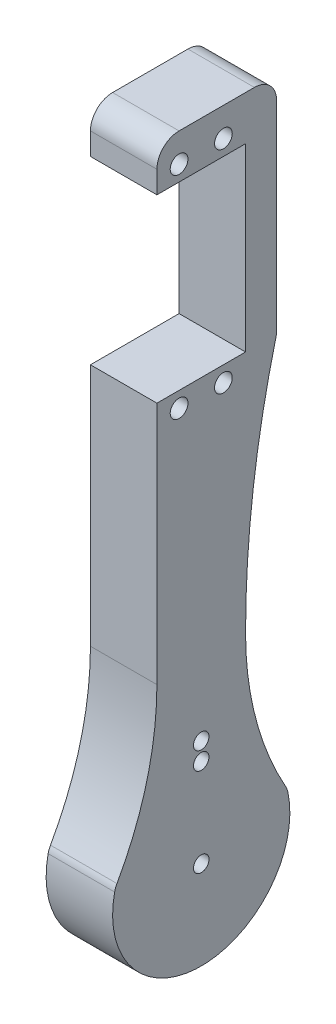
ISO-10303-21;
HEADER;
FILE_DESCRIPTION(('STEP AP214'),'2;1');
FILE_NAME('part.step','',(''),(''),'','','');
FILE_SCHEMA(('AUTOMOTIVE_DESIGN { 1 0 10303 214 1 1 1 1 }'));
ENDSEC;
DATA;
#1=APPLICATION_CONTEXT('core data for automotive mechanical design processes');
#2=APPLICATION_PROTOCOL_DEFINITION('international standard','automotive_design',2000,#1);
#3=PRODUCT_CONTEXT('',#1,'mechanical');
#4=PRODUCT('Part','Part','',(#3));
#5=PRODUCT_RELATED_PRODUCT_CATEGORY('part','',(#4));
#6=PRODUCT_DEFINITION_FORMATION('','',#4);
#7=PRODUCT_DEFINITION_CONTEXT('part definition',#1,'design');
#8=PRODUCT_DEFINITION('design','',#6,#7);
#9=PRODUCT_DEFINITION_SHAPE('','',#8);
#10=(LENGTH_UNIT() NAMED_UNIT(*) SI_UNIT(.MILLI.,.METRE.));
#11=(NAMED_UNIT(*) PLANE_ANGLE_UNIT() SI_UNIT($,.RADIAN.));
#12=(NAMED_UNIT(*) SI_UNIT($,.STERADIAN.) SOLID_ANGLE_UNIT());
#13=UNCERTAINTY_MEASURE_WITH_UNIT(LENGTH_MEASURE(1.E-05),#10,'distance_accuracy_value','');
#14=(GEOMETRIC_REPRESENTATION_CONTEXT(3) GLOBAL_UNCERTAINTY_ASSIGNED_CONTEXT((#13)) GLOBAL_UNIT_ASSIGNED_CONTEXT((#10,
#11,#12)) REPRESENTATION_CONTEXT('',''));
#15=CARTESIAN_POINT('',(0.,0.,0.));
#16=DIRECTION('',(0.,0.,1.));
#17=DIRECTION('',(1.,0.,0.));
#18=AXIS2_PLACEMENT_3D('',#15,#16,#17);
#19=CARTESIAN_POINT('',(15.,40.,80.));
#20=DIRECTION('',(-1.,0.,0.));
#21=DIRECTION('',(0.,0.,1.));
#22=AXIS2_PLACEMENT_3D('',#19,#20,#21);
#23=PLANE('',#22);
#24=CARTESIAN_POINT('',(15.,0.,0.));
#25=DIRECTION('',(-1.,0.,0.));
#26=DIRECTION('',(0.,0.,1.));
#27=AXIS2_PLACEMENT_3D('',#24,#25,#26);
#28=CIRCLE('',#27,1.75);
#29=CARTESIAN_POINT('',(15.,0.,1.75));
#30=VERTEX_POINT('',#29);
#31=EDGE_CURVE('E385',#30,#30,#28,.T.);
#32=ORIENTED_EDGE('',*,*,#31,.T.);
#33=EDGE_LOOP('',(#32));
#34=FACE_BOUND('',#33,.T.);
#35=CARTESIAN_POINT('',(15.,20.,0.));
#36=DIRECTION('',(-1.,0.,0.));
#37=DIRECTION('',(0.,0.,1.));
#38=AXIS2_PLACEMENT_3D('',#35,#36,#37);
#39=CIRCLE('',#38,1.75);
#40=CARTESIAN_POINT('',(15.,20.,1.75));
#41=VERTEX_POINT('',#40);
#42=EDGE_CURVE('E552',#41,#41,#39,.T.);
#43=ORIENTED_EDGE('',*,*,#42,.T.);
#44=EDGE_LOOP('',(#43));
#45=FACE_BOUND('',#44,.T.);
#46=CARTESIAN_POINT('',(15.,24.,0.));
#47=DIRECTION('',(-1.,0.,0.));
#48=DIRECTION('',(0.,0.,1.));
#49=AXIS2_PLACEMENT_3D('',#46,#47,#48);
#50=CIRCLE('',#49,1.75);
#51=CARTESIAN_POINT('',(15.,24.,1.75));
#52=VERTEX_POINT('',#51);
#53=EDGE_CURVE('E545',#52,#52,#50,.T.);
#54=ORIENTED_EDGE('',*,*,#53,.T.);
#55=EDGE_LOOP('',(#54));
#56=FACE_BOUND('',#55,.T.);
#57=DIRECTION('',(0.,0.,1.));
#58=VECTOR('',#57,1.);
#59=CARTESIAN_POINT('',(15.,95.,-10.));
#60=LINE('',#59,#58);
#61=CARTESIAN_POINT('',(15.,95.,-10.));
#62=VERTEX_POINT('',#61);
#63=CARTESIAN_POINT('',(15.,95.,10.));
#64=VERTEX_POINT('',#63);
#65=EDGE_CURVE('E261',#62,#64,#60,.T.);
#66=ORIENTED_EDGE('',*,*,#65,.T.);
#67=DIRECTION('',(0.,-1.,0.));
#68=VECTOR('',#67,1.);
#69=CARTESIAN_POINT('',(15.,95.,10.));
#70=LINE('',#69,#68);
#71=CARTESIAN_POINT('',(15.,40.,10.));
#72=VERTEX_POINT('',#71);
#73=EDGE_CURVE('E139',#64,#72,#70,.T.);
#74=ORIENTED_EDGE('',*,*,#73,.T.);
#75=CARTESIAN_POINT('',(15.,40.,80.));
#76=DIRECTION('',(-1.,0.,0.));
#77=DIRECTION('',(0.,0.,1.));
#78=AXIS2_PLACEMENT_3D('',#75,#76,#77);
#79=CIRCLE('',#78,70.);
#80=CARTESIAN_POINT('',(15.,5.63781686233499,19.0144249021658));
#81=VERTEX_POINT('',#80);
#82=EDGE_CURVE('E316',#72,#81,#79,.T.);
#83=ORIENTED_EDGE('',*,*,#82,.T.);
#84=CARTESIAN_POINT('',(15.,3.18337520964461,14.6583123951777));
#85=DIRECTION('',(1.,0.,0.));
#86=DIRECTION('',(0.,0.,-1.));
#87=AXIS2_PLACEMENT_3D('',#84,#85,#86);
#88=CIRCLE('',#87,5.);
#89=CARTESIAN_POINT('',(15.,4.24450027952615,19.5444165269036));
#90=VERTEX_POINT('',#89);
#91=EDGE_CURVE('E336',#81,#90,#88,.T.);
#92=ORIENTED_EDGE('',*,*,#91,.T.);
#93=CARTESIAN_POINT('',(15.,0.,0.));
#94=DIRECTION('',(1.,0.,0.));
#95=DIRECTION('',(0.,0.,-1.));
#96=AXIS2_PLACEMENT_3D('',#93,#94,#95);
#97=CIRCLE('',#96,20.);
#98=CARTESIAN_POINT('',(15.,4.24450027952615,-19.5444165269036));
#99=VERTEX_POINT('',#98);
#100=EDGE_CURVE('E332',#90,#99,#97,.T.);
#101=ORIENTED_EDGE('',*,*,#100,.T.);
#102=CARTESIAN_POINT('',(15.,3.18337520964461,-14.6583123951777));
#103=DIRECTION('',(1.,0.,0.));
#104=DIRECTION('',(0.,0.,1.));
#105=AXIS2_PLACEMENT_3D('',#102,#103,#104);
#106=CIRCLE('',#105,5.);
#107=CARTESIAN_POINT('',(15.,5.63781686233497,-19.0144249021658));
#108=VERTEX_POINT('',#107);
#109=EDGE_CURVE('E335',#99,#108,#106,.T.);
#110=ORIENTED_EDGE('',*,*,#109,.T.);
#111=CARTESIAN_POINT('',(15.,40.,-80.));
#112=DIRECTION('',(-1.,0.,0.));
#113=DIRECTION('',(0.,0.,-1.));
#114=AXIS2_PLACEMENT_3D('',#111,#112,#113);
#115=CIRCLE('',#114,70.);
#116=CARTESIAN_POINT('',(15.,40.,-10.));
#117=VERTEX_POINT('',#116);
#118=EDGE_CURVE('E342',#108,#117,#115,.T.);
#119=ORIENTED_EDGE('',*,*,#118,.T.);
#120=CARTESIAN_POINT('',(15.,40.,-229.571428571429));
#121=DIRECTION('',(-1.,0.,0.));
#122=DIRECTION('',(0.,0.,1.));
#123=AXIS2_PLACEMENT_3D('',#120,#121,#122);
#124=CIRCLE('',#123,219.571428571429);
#125=CARTESIAN_POINT('',(15.,94.394082104943,-16.8441475826972));
#126=VERTEX_POINT('',#125);
#127=EDGE_CURVE('E349',#117,#126,#124,.T.);
#128=ORIENTED_EDGE('',*,*,#127,.T.);
#129=CARTESIAN_POINT('',(15.,95.6327241828045,-12.));
#130=DIRECTION('',(1.,0.,0.));
#131=DIRECTION('',(0.,0.,1.));
#132=AXIS2_PLACEMENT_3D('',#129,#130,#131);
#133=CIRCLE('',#132,4.99999999999999);
#134=CARTESIAN_POINT('',(15.,95.6327241828045,-17.));
#135=VERTEX_POINT('',#134);
#136=EDGE_CURVE('E351',#126,#135,#133,.T.);
#137=ORIENTED_EDGE('',*,*,#136,.T.);
#138=DIRECTION('',(0.,1.,0.));
#139=VECTOR('',#138,1.);
#140=CARTESIAN_POINT('',(15.,95.6327241828045,-17.));
#141=LINE('',#140,#139);
#142=CARTESIAN_POINT('',(15.,140.7,-17.));
#143=VERTEX_POINT('',#142);
#144=EDGE_CURVE('E354',#135,#143,#141,.T.);
#145=ORIENTED_EDGE('',*,*,#144,.T.);
#146=CARTESIAN_POINT('',(15.,140.7,-12.));
#147=DIRECTION('',(1.,0.,0.));
#148=DIRECTION('',(0.,0.,1.));
#149=AXIS2_PLACEMENT_3D('',#146,#147,#148);
#150=CIRCLE('',#149,5.);
#151=CARTESIAN_POINT('',(15.,145.7,-12.));
#152=VERTEX_POINT('',#151);
#153=EDGE_CURVE('E357',#143,#152,#150,.T.);
#154=ORIENTED_EDGE('',*,*,#153,.T.);
#155=DIRECTION('',(0.,0.,1.));
#156=VECTOR('',#155,1.);
#157=CARTESIAN_POINT('',(15.,145.7,-12.));
#158=LINE('',#157,#156);
#159=CARTESIAN_POINT('',(15.,145.7,4.99999999999996));
#160=VERTEX_POINT('',#159);
#161=EDGE_CURVE('E360',#152,#160,#158,.T.);
#162=ORIENTED_EDGE('',*,*,#161,.T.);
#163=CARTESIAN_POINT('',(15.,140.7,5.));
#164=DIRECTION('',(1.,0.,0.));
#165=DIRECTION('',(0.,0.,-1.));
#166=AXIS2_PLACEMENT_3D('',#163,#164,#165);
#167=CIRCLE('',#166,5.);
#168=CARTESIAN_POINT('',(15.,140.7,10.));
#169=VERTEX_POINT('',#168);
#170=EDGE_CURVE('E186',#160,#169,#167,.T.);
#171=ORIENTED_EDGE('',*,*,#170,.T.);
#172=DIRECTION('',(0.,-1.,0.));
#173=VECTOR('',#172,1.);
#174=CARTESIAN_POINT('',(15.,140.7,10.));
#175=LINE('',#174,#173);
#176=CARTESIAN_POINT('',(15.,135.7,10.));
#177=VERTEX_POINT('',#176);
#178=EDGE_CURVE('E179',#169,#177,#175,.T.);
#179=ORIENTED_EDGE('',*,*,#178,.T.);
#180=DIRECTION('',(0.,0.,-1.));
#181=VECTOR('',#180,1.);
#182=CARTESIAN_POINT('',(15.,135.7,10.));
#183=LINE('',#182,#181);
#184=CARTESIAN_POINT('',(15.,135.7,-10.));
#185=VERTEX_POINT('',#184);
#186=EDGE_CURVE('E183',#177,#185,#183,.T.);
#187=ORIENTED_EDGE('',*,*,#186,.T.);
#188=DIRECTION('',(0.,-1.,0.));
#189=VECTOR('',#188,1.);
#190=CARTESIAN_POINT('',(15.,135.7,-10.));
#191=LINE('',#190,#189);
#192=EDGE_CURVE('E74',#185,#62,#191,.T.);
#193=ORIENTED_EDGE('',*,*,#192,.T.);
#194=EDGE_LOOP('',(#66,#74,#83,#92,#101,#110,#119,#128,#137,#145,#154,#162,#171,#179,#187,#193));
#195=FACE_BOUND('',#194,.T.);
#196=CARTESIAN_POINT('',(15.,139.2,-5.));
#197=DIRECTION('',(1.,0.,0.));
#198=DIRECTION('',(0.,0.,-1.));
#199=AXIS2_PLACEMENT_3D('',#196,#197,#198);
#200=CIRCLE('',#199,2.);
#201=CARTESIAN_POINT('',(15.,139.2,-7.));
#202=VERTEX_POINT('',#201);
#203=EDGE_CURVE('E219',#202,#202,#200,.T.);
#204=ORIENTED_EDGE('',*,*,#203,.F.);
#205=EDGE_LOOP('',(#204));
#206=FACE_BOUND('',#205,.T.);
#207=CARTESIAN_POINT('',(15.,139.2,5.));
#208=DIRECTION('',(1.,0.,0.));
#209=DIRECTION('',(0.,0.,-1.));
#210=AXIS2_PLACEMENT_3D('',#207,#208,#209);
#211=CIRCLE('',#210,2.);
#212=CARTESIAN_POINT('',(15.,139.2,3.));
#213=VERTEX_POINT('',#212);
#214=EDGE_CURVE('E439',#213,#213,#211,.T.);
#215=ORIENTED_EDGE('',*,*,#214,.F.);
#216=EDGE_LOOP('',(#215));
#217=FACE_BOUND('',#216,.T.);
#218=CARTESIAN_POINT('',(15.,91.5,-5.));
#219=DIRECTION('',(1.,0.,0.));
#220=DIRECTION('',(0.,0.,1.));
#221=AXIS2_PLACEMENT_3D('',#218,#219,#220);
#222=CIRCLE('',#221,2.);
#223=CARTESIAN_POINT('',(15.,91.5,-3.00000000000001));
#224=VERTEX_POINT('',#223);
#225=EDGE_CURVE('E447',#224,#224,#222,.T.);
#226=ORIENTED_EDGE('',*,*,#225,.F.);
#227=EDGE_LOOP('',(#226));
#228=FACE_BOUND('',#227,.T.);
#229=CARTESIAN_POINT('',(15.,91.5,4.99999999999999));
#230=DIRECTION('',(1.,0.,0.));
#231=DIRECTION('',(0.,0.,1.));
#232=AXIS2_PLACEMENT_3D('',#229,#230,#231);
#233=CIRCLE('',#232,2.);
#234=CARTESIAN_POINT('',(15.,91.5,6.99999999999999));
#235=VERTEX_POINT('',#234);
#236=EDGE_CURVE('E457',#235,#235,#233,.T.);
#237=ORIENTED_EDGE('',*,*,#236,.F.);
#238=EDGE_LOOP('',(#237));
#239=FACE_BOUND('',#238,.T.);
#240=ADVANCED_FACE('F49',(#34,#45,#56,#195,#206,#217,#228,#239),#23,.F.);
#241=CARTESIAN_POINT('',(0.,40.,80.));
#242=DIRECTION('',(-1.,0.,0.));
#243=DIRECTION('',(0.,0.,1.));
#244=AXIS2_PLACEMENT_3D('',#241,#242,#243);
#245=PLANE('',#244);
#246=CARTESIAN_POINT('',(0.,11.9999999999999,-16.5000000000001));
#247=DIRECTION('',(1.,0.,0.));
#248=DIRECTION('',(0.,0.,-1.));
#249=AXIS2_PLACEMENT_3D('',#246,#247,#248);
#250=CIRCLE('',#249,13.);
#251=CARTESIAN_POINT('',(0.,12.,-3.5000000000001));
#252=VERTEX_POINT('',#251);
#253=CARTESIAN_POINT('',(0.,5.15357012521899,-5.44891869681045));
#254=VERTEX_POINT('',#253);
#255=EDGE_CURVE('E65',#252,#254,#250,.T.);
#256=ORIENTED_EDGE('',*,*,#255,.F.);
#257=DIRECTION('',(0.,-1.,0.));
#258=VECTOR('',#257,1.);
#259=CARTESIAN_POINT('',(0.,24.3305385599999,-3.50000000000017));
#260=LINE('',#259,#258);
#261=CARTESIAN_POINT('',(0.,24.3305385599999,-3.50000000000017));
#262=VERTEX_POINT('',#261);
#263=EDGE_CURVE('E517',#262,#252,#260,.T.);
#264=ORIENTED_EDGE('',*,*,#263,.F.);
#265=CARTESIAN_POINT('',(0.,24.33053856,-1.87350135405495E-13));
#266=DIRECTION('',(-1.,0.,0.));
#267=DIRECTION('',(0.,0.,1.));
#268=AXIS2_PLACEMENT_3D('',#265,#266,#267);
#269=CIRCLE('',#268,3.49999999999998);
#270=CARTESIAN_POINT('',(0.,24.33053856,3.49999999999979));
#271=VERTEX_POINT('',#270);
#272=EDGE_CURVE('E505',#271,#262,#269,.T.);
#273=ORIENTED_EDGE('',*,*,#272,.F.);
#274=DIRECTION('',(0.,1.,0.));
#275=VECTOR('',#274,1.);
#276=CARTESIAN_POINT('',(0.,24.33053856,3.49999999999979));
#277=LINE('',#276,#275);
#278=CARTESIAN_POINT('',(0.,12.,3.4999999999999));
#279=VERTEX_POINT('',#278);
#280=EDGE_CURVE('E525',#279,#271,#277,.T.);
#281=ORIENTED_EDGE('',*,*,#280,.F.);
#282=CARTESIAN_POINT('',(0.,12.0000000000001,16.4999999999999));
#283=DIRECTION('',(1.,0.,0.));
#284=DIRECTION('',(0.,0.,1.));
#285=AXIS2_PLACEMENT_3D('',#282,#283,#284);
#286=CIRCLE('',#285,13.);
#287=CARTESIAN_POINT('',(0.,5.15357012521907,5.44891869681037));
#288=VERTEX_POINT('',#287);
#289=EDGE_CURVE('E529',#288,#279,#286,.T.);
#290=ORIENTED_EDGE('',*,*,#289,.F.);
#291=CARTESIAN_POINT('',(0.,0.,0.));
#292=DIRECTION('',(-1.,0.,0.));
#293=DIRECTION('',(0.,0.,1.));
#294=AXIS2_PLACEMENT_3D('',#291,#292,#293);
#295=CIRCLE('',#294,7.50000000000001);
#296=EDGE_CURVE('E367',#254,#288,#295,.T.);
#297=ORIENTED_EDGE('',*,*,#296,.F.);
#298=EDGE_LOOP('',(#256,#264,#273,#281,#290,#297));
#299=FACE_BOUND('',#298,.T.);
#300=CARTESIAN_POINT('',(0.,91.5,-5.));
#301=DIRECTION('',(1.,0.,0.));
#302=DIRECTION('',(0.,0.,1.));
#303=AXIS2_PLACEMENT_3D('',#300,#301,#302);
#304=CIRCLE('',#303,2.);
#305=CARTESIAN_POINT('',(0.,91.5,-3.00000000000001));
#306=VERTEX_POINT('',#305);
#307=EDGE_CURVE('E453',#306,#306,#304,.T.);
#308=ORIENTED_EDGE('',*,*,#307,.T.);
#309=EDGE_LOOP('',(#308));
#310=FACE_BOUND('',#309,.T.);
#311=CARTESIAN_POINT('',(0.,139.2,-5.));
#312=DIRECTION('',(1.,0.,0.));
#313=DIRECTION('',(0.,0.,-1.));
#314=AXIS2_PLACEMENT_3D('',#311,#312,#313);
#315=CIRCLE('',#314,2.);
#316=CARTESIAN_POINT('',(0.,139.2,-7.));
#317=VERTEX_POINT('',#316);
#318=EDGE_CURVE('E434',#317,#317,#315,.T.);
#319=ORIENTED_EDGE('',*,*,#318,.T.);
#320=EDGE_LOOP('',(#319));
#321=FACE_BOUND('',#320,.T.);
#322=DIRECTION('',(0.,0.,1.));
#323=VECTOR('',#322,1.);
#324=CARTESIAN_POINT('',(0.,95.,-10.));
#325=LINE('',#324,#323);
#326=CARTESIAN_POINT('',(0.,95.,-10.));
#327=VERTEX_POINT('',#326);
#328=CARTESIAN_POINT('',(0.,95.,10.));
#329=VERTEX_POINT('',#328);
#330=EDGE_CURVE('E214',#327,#329,#325,.T.);
#331=ORIENTED_EDGE('',*,*,#330,.F.);
#332=DIRECTION('',(0.,-1.,0.));
#333=VECTOR('',#332,1.);
#334=CARTESIAN_POINT('',(0.,135.7,-10.));
#335=LINE('',#334,#333);
#336=CARTESIAN_POINT('',(0.,135.7,-10.));
#337=VERTEX_POINT('',#336);
#338=EDGE_CURVE('E131',#337,#327,#335,.T.);
#339=ORIENTED_EDGE('',*,*,#338,.F.);
#340=DIRECTION('',(0.,0.,-1.));
#341=VECTOR('',#340,1.);
#342=CARTESIAN_POINT('',(0.,135.7,10.));
#343=LINE('',#342,#341);
#344=CARTESIAN_POINT('',(0.,135.7,10.));
#345=VERTEX_POINT('',#344);
#346=EDGE_CURVE('E256',#345,#337,#343,.T.);
#347=ORIENTED_EDGE('',*,*,#346,.F.);
#348=DIRECTION('',(0.,-1.,0.));
#349=VECTOR('',#348,1.);
#350=CARTESIAN_POINT('',(0.,140.7,10.));
#351=LINE('',#350,#349);
#352=CARTESIAN_POINT('',(0.,140.7,10.));
#353=VERTEX_POINT('',#352);
#354=EDGE_CURVE('E196',#353,#345,#351,.T.);
#355=ORIENTED_EDGE('',*,*,#354,.F.);
#356=CARTESIAN_POINT('',(0.,140.7,5.));
#357=DIRECTION('',(1.,0.,0.));
#358=DIRECTION('',(0.,0.,-1.));
#359=AXIS2_PLACEMENT_3D('',#356,#357,#358);
#360=CIRCLE('',#359,5.);
#361=CARTESIAN_POINT('',(0.,145.7,4.99999999999996));
#362=VERTEX_POINT('',#361);
#363=EDGE_CURVE('E251',#362,#353,#360,.T.);
#364=ORIENTED_EDGE('',*,*,#363,.F.);
#365=DIRECTION('',(0.,0.,1.));
#366=VECTOR('',#365,1.);
#367=CARTESIAN_POINT('',(0.,145.7,-12.));
#368=LINE('',#367,#366);
#369=CARTESIAN_POINT('',(0.,145.7,-12.));
#370=VERTEX_POINT('',#369);
#371=EDGE_CURVE('E248',#370,#362,#368,.T.);
#372=ORIENTED_EDGE('',*,*,#371,.F.);
#373=CARTESIAN_POINT('',(0.,140.7,-12.));
#374=DIRECTION('',(1.,0.,0.));
#375=DIRECTION('',(0.,0.,1.));
#376=AXIS2_PLACEMENT_3D('',#373,#374,#375);
#377=CIRCLE('',#376,5.);
#378=CARTESIAN_POINT('',(0.,140.7,-17.));
#379=VERTEX_POINT('',#378);
#380=EDGE_CURVE('E245',#379,#370,#377,.T.);
#381=ORIENTED_EDGE('',*,*,#380,.F.);
#382=DIRECTION('',(0.,1.,0.));
#383=VECTOR('',#382,1.);
#384=CARTESIAN_POINT('',(0.,95.6327241828045,-17.));
#385=LINE('',#384,#383);
#386=CARTESIAN_POINT('',(0.,95.6327241828045,-17.));
#387=VERTEX_POINT('',#386);
#388=EDGE_CURVE('E242',#387,#379,#385,.T.);
#389=ORIENTED_EDGE('',*,*,#388,.F.);
#390=CARTESIAN_POINT('',(0.,95.6327241828045,-12.));
#391=DIRECTION('',(1.,0.,0.));
#392=DIRECTION('',(0.,0.,1.));
#393=AXIS2_PLACEMENT_3D('',#390,#391,#392);
#394=CIRCLE('',#393,4.99999999999999);
#395=CARTESIAN_POINT('',(0.,94.394082104943,-16.8441475826972));
#396=VERTEX_POINT('',#395);
#397=EDGE_CURVE('E239',#396,#387,#394,.T.);
#398=ORIENTED_EDGE('',*,*,#397,.F.);
#399=CARTESIAN_POINT('',(0.,40.,-229.571428571429));
#400=DIRECTION('',(-1.,0.,0.));
#401=DIRECTION('',(0.,0.,1.));
#402=AXIS2_PLACEMENT_3D('',#399,#400,#401);
#403=CIRCLE('',#402,219.571428571429);
#404=CARTESIAN_POINT('',(0.,40.,-10.));
#405=VERTEX_POINT('',#404);
#406=EDGE_CURVE('E236',#405,#396,#403,.T.);
#407=ORIENTED_EDGE('',*,*,#406,.F.);
#408=CARTESIAN_POINT('',(0.,40.,-80.));
#409=DIRECTION('',(-1.,0.,0.));
#410=DIRECTION('',(0.,0.,-1.));
#411=AXIS2_PLACEMENT_3D('',#408,#409,#410);
#412=CIRCLE('',#411,70.);
#413=CARTESIAN_POINT('',(0.,5.63781686233497,-19.0144249021658));
#414=VERTEX_POINT('',#413);
#415=EDGE_CURVE('E234',#414,#405,#412,.T.);
#416=ORIENTED_EDGE('',*,*,#415,.F.);
#417=CARTESIAN_POINT('',(0.,3.18337520964461,-14.6583123951777));
#418=DIRECTION('',(1.,0.,0.));
#419=DIRECTION('',(0.,0.,1.));
#420=AXIS2_PLACEMENT_3D('',#417,#418,#419);
#421=CIRCLE('',#420,5.);
#422=CARTESIAN_POINT('',(0.,4.24450027952615,-19.5444165269036));
#423=VERTEX_POINT('',#422);
#424=EDGE_CURVE('E231',#423,#414,#421,.T.);
#425=ORIENTED_EDGE('',*,*,#424,.F.);
#426=CARTESIAN_POINT('',(0.,0.,0.));
#427=DIRECTION('',(1.,0.,0.));
#428=DIRECTION('',(0.,0.,-1.));
#429=AXIS2_PLACEMENT_3D('',#426,#427,#428);
#430=CIRCLE('',#429,20.);
#431=CARTESIAN_POINT('',(0.,4.24450027952615,19.5444165269036));
#432=VERTEX_POINT('',#431);
#433=EDGE_CURVE('E228',#432,#423,#430,.T.);
#434=ORIENTED_EDGE('',*,*,#433,.F.);
#435=CARTESIAN_POINT('',(0.,3.18337520964461,14.6583123951777));
#436=DIRECTION('',(1.,0.,0.));
#437=DIRECTION('',(0.,0.,-1.));
#438=AXIS2_PLACEMENT_3D('',#435,#436,#437);
#439=CIRCLE('',#438,5.);
#440=CARTESIAN_POINT('',(0.,5.63781686233499,19.0144249021658));
#441=VERTEX_POINT('',#440);
#442=EDGE_CURVE('E225',#441,#432,#439,.T.);
#443=ORIENTED_EDGE('',*,*,#442,.F.);
#444=CARTESIAN_POINT('',(0.,40.,80.));
#445=DIRECTION('',(-1.,0.,0.));
#446=DIRECTION('',(0.,0.,1.));
#447=AXIS2_PLACEMENT_3D('',#444,#445,#446);
#448=CIRCLE('',#447,70.);
#449=CARTESIAN_POINT('',(0.,40.,10.));
#450=VERTEX_POINT('',#449);
#451=EDGE_CURVE('E222',#450,#441,#448,.T.);
#452=ORIENTED_EDGE('',*,*,#451,.F.);
#453=DIRECTION('',(0.,-1.,0.));
#454=VECTOR('',#453,1.);
#455=CARTESIAN_POINT('',(0.,95.,10.));
#456=LINE('',#455,#454);
#457=EDGE_CURVE('E218',#329,#450,#456,.T.);
#458=ORIENTED_EDGE('',*,*,#457,.F.);
#459=EDGE_LOOP('',(#331,#339,#347,#355,#364,#372,#381,#389,#398,#407,#416,#425,#434,#443,#452,#458));
#460=FACE_BOUND('',#459,.T.);
#461=CARTESIAN_POINT('',(0.,139.2,5.));
#462=DIRECTION('',(1.,0.,0.));
#463=DIRECTION('',(0.,0.,-1.));
#464=AXIS2_PLACEMENT_3D('',#461,#462,#463);
#465=CIRCLE('',#464,2.);
#466=CARTESIAN_POINT('',(0.,139.2,3.));
#467=VERTEX_POINT('',#466);
#468=EDGE_CURVE('E443',#467,#467,#465,.T.);
#469=ORIENTED_EDGE('',*,*,#468,.T.);
#470=EDGE_LOOP('',(#469));
#471=FACE_BOUND('',#470,.T.);
#472=CARTESIAN_POINT('',(0.,91.5,4.99999999999999));
#473=DIRECTION('',(1.,0.,0.));
#474=DIRECTION('',(0.,0.,1.));
#475=AXIS2_PLACEMENT_3D('',#472,#473,#474);
#476=CIRCLE('',#475,2.);
#477=CARTESIAN_POINT('',(0.,91.5,6.99999999999999));
#478=VERTEX_POINT('',#477);
#479=EDGE_CURVE('E461',#478,#478,#476,.T.);
#480=ORIENTED_EDGE('',*,*,#479,.T.);
#481=EDGE_LOOP('',(#480));
#482=FACE_BOUND('',#481,.T.);
#483=ADVANCED_FACE('F320',(#299,#310,#321,#460,#471,#482),#245,.T.);
#484=CARTESIAN_POINT('',(15.,95.,-10.));
#485=DIRECTION('',(0.,-1.,0.));
#486=DIRECTION('',(0.,0.,-1.));
#487=AXIS2_PLACEMENT_3D('',#484,#485,#486);
#488=PLANE('',#487);
#489=ORIENTED_EDGE('',*,*,#330,.T.);
#490=DIRECTION('',(-1.,0.,0.));
#491=VECTOR('',#490,1.);
#492=CARTESIAN_POINT('',(15.,95.,10.));
#493=LINE('',#492,#491);
#494=EDGE_CURVE('E11',#64,#329,#493,.T.);
#495=ORIENTED_EDGE('',*,*,#494,.F.);
#496=ORIENTED_EDGE('',*,*,#65,.F.);
#497=DIRECTION('',(-1.,0.,0.));
#498=VECTOR('',#497,1.);
#499=CARTESIAN_POINT('',(15.,95.,-10.));
#500=LINE('',#499,#498);
#501=EDGE_CURVE('E210',#62,#327,#500,.T.);
#502=ORIENTED_EDGE('',*,*,#501,.T.);
#503=EDGE_LOOP('',(#489,#495,#496,#502));
#504=FACE_BOUND('',#503,.T.);
#505=ADVANCED_FACE('F51',(#504),#488,.F.);
#506=CARTESIAN_POINT('',(15.,95.,10.));
#507=DIRECTION('',(0.,0.,-1.));
#508=DIRECTION('',(0.,1.,0.));
#509=AXIS2_PLACEMENT_3D('',#506,#507,#508);
#510=PLANE('',#509);
#511=ORIENTED_EDGE('',*,*,#457,.T.);
#512=DIRECTION('',(-1.,0.,0.));
#513=VECTOR('',#512,1.);
#514=CARTESIAN_POINT('',(15.,40.,10.));
#515=LINE('',#514,#513);
#516=EDGE_CURVE('E58',#72,#450,#515,.T.);
#517=ORIENTED_EDGE('',*,*,#516,.F.);
#518=ORIENTED_EDGE('',*,*,#73,.F.);
#519=ORIENTED_EDGE('',*,*,#494,.T.);
#520=EDGE_LOOP('',(#511,#517,#518,#519));
#521=FACE_BOUND('',#520,.T.);
#522=ADVANCED_FACE('F685',(#521),#510,.F.);
#523=CARTESIAN_POINT('',(15.,40.,80.));
#524=DIRECTION('',(-1.,0.,0.));
#525=DIRECTION('',(0.,0.,1.));
#526=AXIS2_PLACEMENT_3D('',#523,#524,#525);
#527=CYLINDRICAL_SURFACE('',#526,70.);
#528=ORIENTED_EDGE('',*,*,#451,.T.);
#529=DIRECTION('',(-1.,0.,0.));
#530=VECTOR('',#529,1.);
#531=CARTESIAN_POINT('',(15.,5.63781686233499,19.0144249021658));
#532=LINE('',#531,#530);
#533=EDGE_CURVE('E304',#81,#441,#532,.T.);
#534=ORIENTED_EDGE('',*,*,#533,.F.);
#535=ORIENTED_EDGE('',*,*,#82,.F.);
#536=ORIENTED_EDGE('',*,*,#516,.T.);
#537=EDGE_LOOP('',(#528,#534,#535,#536));
#538=FACE_BOUND('',#537,.T.);
#539=ADVANCED_FACE('F314',(#538),#527,.F.);
#540=CARTESIAN_POINT('',(15.,3.18337520964461,14.6583123951777));
#541=DIRECTION('',(-1.,0.,0.));
#542=DIRECTION('',(0.,0.,1.));
#543=AXIS2_PLACEMENT_3D('',#540,#541,#542);
#544=CYLINDRICAL_SURFACE('',#543,5.);
#545=ORIENTED_EDGE('',*,*,#442,.T.);
#546=DIRECTION('',(-1.,0.,0.));
#547=VECTOR('',#546,1.);
#548=CARTESIAN_POINT('',(15.,4.24450027952615,19.5444165269036));
#549=LINE('',#548,#547);
#550=EDGE_CURVE('E300',#90,#432,#549,.T.);
#551=ORIENTED_EDGE('',*,*,#550,.F.);
#552=ORIENTED_EDGE('',*,*,#91,.F.);
#553=ORIENTED_EDGE('',*,*,#533,.T.);
#554=EDGE_LOOP('',(#545,#551,#552,#553));
#555=FACE_BOUND('',#554,.T.);
#556=ADVANCED_FACE('F326',(#555),#544,.T.);
#557=CARTESIAN_POINT('',(15.,0.,0.));
#558=DIRECTION('',(-1.,0.,0.));
#559=DIRECTION('',(0.,0.,1.));
#560=AXIS2_PLACEMENT_3D('',#557,#558,#559);
#561=CYLINDRICAL_SURFACE('',#560,20.);
#562=ORIENTED_EDGE('',*,*,#433,.T.);
#563=DIRECTION('',(-1.,0.,0.));
#564=VECTOR('',#563,1.);
#565=CARTESIAN_POINT('',(15.,4.24450027952615,-19.5444165269036));
#566=LINE('',#565,#564);
#567=EDGE_CURVE('E296',#99,#423,#566,.T.);
#568=ORIENTED_EDGE('',*,*,#567,.F.);
#569=ORIENTED_EDGE('',*,*,#100,.F.);
#570=ORIENTED_EDGE('',*,*,#550,.T.);
#571=EDGE_LOOP('',(#562,#568,#569,#570));
#572=FACE_BOUND('',#571,.T.);
#573=ADVANCED_FACE('F330',(#572),#561,.T.);
#574=CARTESIAN_POINT('',(15.,3.18337520964461,-14.6583123951777));
#575=DIRECTION('',(-1.,0.,0.));
#576=DIRECTION('',(0.,0.,1.));
#577=AXIS2_PLACEMENT_3D('',#574,#575,#576);
#578=CYLINDRICAL_SURFACE('',#577,5.);
#579=ORIENTED_EDGE('',*,*,#424,.T.);
#580=DIRECTION('',(-1.,0.,0.));
#581=VECTOR('',#580,1.);
#582=CARTESIAN_POINT('',(15.,5.63781686233497,-19.0144249021658));
#583=LINE('',#582,#581);
#584=EDGE_CURVE('E292',#108,#414,#583,.T.);
#585=ORIENTED_EDGE('',*,*,#584,.F.);
#586=ORIENTED_EDGE('',*,*,#109,.F.);
#587=ORIENTED_EDGE('',*,*,#567,.T.);
#588=EDGE_LOOP('',(#579,#585,#586,#587));
#589=FACE_BOUND('',#588,.T.);
#590=ADVANCED_FACE('F675',(#589),#578,.T.);
#591=CARTESIAN_POINT('',(15.,40.,-80.));
#592=DIRECTION('',(-1.,0.,0.));
#593=DIRECTION('',(0.,0.,1.));
#594=AXIS2_PLACEMENT_3D('',#591,#592,#593);
#595=CYLINDRICAL_SURFACE('',#594,70.);
#596=ORIENTED_EDGE('',*,*,#415,.T.);
#597=DIRECTION('',(-1.,0.,0.));
#598=VECTOR('',#597,1.);
#599=CARTESIAN_POINT('',(15.,40.,-10.));
#600=LINE('',#599,#598);
#601=EDGE_CURVE('E288',#117,#405,#600,.T.);
#602=ORIENTED_EDGE('',*,*,#601,.F.);
#603=ORIENTED_EDGE('',*,*,#118,.F.);
#604=ORIENTED_EDGE('',*,*,#584,.T.);
#605=EDGE_LOOP('',(#596,#602,#603,#604));
#606=FACE_BOUND('',#605,.T.);
#607=ADVANCED_FACE('F671',(#606),#595,.F.);
#608=CARTESIAN_POINT('',(15.,40.,-229.571428571429));
#609=DIRECTION('',(-1.,0.,0.));
#610=DIRECTION('',(0.,0.,1.));
#611=AXIS2_PLACEMENT_3D('',#608,#609,#610);
#612=CYLINDRICAL_SURFACE('',#611,219.571428571429);
#613=ORIENTED_EDGE('',*,*,#406,.T.);
#614=DIRECTION('',(-1.,0.,0.));
#615=VECTOR('',#614,1.);
#616=CARTESIAN_POINT('',(15.,94.394082104943,-16.8441475826972));
#617=LINE('',#616,#615);
#618=EDGE_CURVE('E284',#126,#396,#617,.T.);
#619=ORIENTED_EDGE('',*,*,#618,.F.);
#620=ORIENTED_EDGE('',*,*,#127,.F.);
#621=ORIENTED_EDGE('',*,*,#601,.T.);
#622=EDGE_LOOP('',(#613,#619,#620,#621));
#623=FACE_BOUND('',#622,.T.);
#624=ADVANCED_FACE('F667',(#623),#612,.F.);
#625=CARTESIAN_POINT('',(15.,95.6327241828045,-12.));
#626=DIRECTION('',(-1.,0.,0.));
#627=DIRECTION('',(0.,0.,1.));
#628=AXIS2_PLACEMENT_3D('',#625,#626,#627);
#629=CYLINDRICAL_SURFACE('',#628,4.99999999999999);
#630=ORIENTED_EDGE('',*,*,#397,.T.);
#631=DIRECTION('',(-1.,0.,0.));
#632=VECTOR('',#631,1.);
#633=CARTESIAN_POINT('',(15.,95.6327241828045,-17.));
#634=LINE('',#633,#632);
#635=EDGE_CURVE('E280',#135,#387,#634,.T.);
#636=ORIENTED_EDGE('',*,*,#635,.F.);
#637=ORIENTED_EDGE('',*,*,#136,.F.);
#638=ORIENTED_EDGE('',*,*,#618,.T.);
#639=EDGE_LOOP('',(#630,#636,#637,#638));
#640=FACE_BOUND('',#639,.T.);
#641=ADVANCED_FACE('F663',(#640),#629,.T.);
#642=CARTESIAN_POINT('',(15.,95.6327241828045,-17.));
#643=DIRECTION('',(0.,0.,1.));
#644=DIRECTION('',(1.,0.,0.));
#645=AXIS2_PLACEMENT_3D('',#642,#643,#644);
#646=PLANE('',#645);
#647=ORIENTED_EDGE('',*,*,#388,.T.);
#648=DIRECTION('',(-1.,0.,0.));
#649=VECTOR('',#648,1.);
#650=CARTESIAN_POINT('',(15.,140.7,-17.));
#651=LINE('',#650,#649);
#652=EDGE_CURVE('E276',#143,#379,#651,.T.);
#653=ORIENTED_EDGE('',*,*,#652,.F.);
#654=ORIENTED_EDGE('',*,*,#144,.F.);
#655=ORIENTED_EDGE('',*,*,#635,.T.);
#656=EDGE_LOOP('',(#647,#653,#654,#655));
#657=FACE_BOUND('',#656,.T.);
#658=ADVANCED_FACE('F659',(#657),#646,.F.);
#659=CARTESIAN_POINT('',(15.,140.7,-12.));
#660=DIRECTION('',(-1.,0.,0.));
#661=DIRECTION('',(0.,0.,1.));
#662=AXIS2_PLACEMENT_3D('',#659,#660,#661);
#663=CYLINDRICAL_SURFACE('',#662,5.);
#664=ORIENTED_EDGE('',*,*,#380,.T.);
#665=DIRECTION('',(-1.,0.,0.));
#666=VECTOR('',#665,1.);
#667=CARTESIAN_POINT('',(15.,145.7,-12.));
#668=LINE('',#667,#666);
#669=EDGE_CURVE('E272',#152,#370,#668,.T.);
#670=ORIENTED_EDGE('',*,*,#669,.F.);
#671=ORIENTED_EDGE('',*,*,#153,.F.);
#672=ORIENTED_EDGE('',*,*,#652,.T.);
#673=EDGE_LOOP('',(#664,#670,#671,#672));
#674=FACE_BOUND('',#673,.T.);
#675=ADVANCED_FACE('F655',(#674),#663,.T.);
#676=CARTESIAN_POINT('',(15.,145.7,-12.));
#677=DIRECTION('',(0.,-1.,0.));
#678=DIRECTION('',(0.,0.,-1.));
#679=AXIS2_PLACEMENT_3D('',#676,#677,#678);
#680=PLANE('',#679);
#681=ORIENTED_EDGE('',*,*,#371,.T.);
#682=DIRECTION('',(-1.,0.,0.));
#683=VECTOR('',#682,1.);
#684=CARTESIAN_POINT('',(15.,145.7,4.99999999999996));
#685=LINE('',#684,#683);
#686=EDGE_CURVE('E268',#160,#362,#685,.T.);
#687=ORIENTED_EDGE('',*,*,#686,.F.);
#688=ORIENTED_EDGE('',*,*,#161,.F.);
#689=ORIENTED_EDGE('',*,*,#669,.T.);
#690=EDGE_LOOP('',(#681,#687,#688,#689));
#691=FACE_BOUND('',#690,.T.);
#692=ADVANCED_FACE('F651',(#691),#680,.F.);
#693=CARTESIAN_POINT('',(15.,140.7,5.));
#694=DIRECTION('',(-1.,0.,0.));
#695=DIRECTION('',(0.,0.,1.));
#696=AXIS2_PLACEMENT_3D('',#693,#694,#695);
#697=CYLINDRICAL_SURFACE('',#696,5.);
#698=ORIENTED_EDGE('',*,*,#363,.T.);
#699=DIRECTION('',(-1.,0.,0.));
#700=VECTOR('',#699,1.);
#701=CARTESIAN_POINT('',(15.,140.7,10.));
#702=LINE('',#701,#700);
#703=EDGE_CURVE('E200',#169,#353,#702,.T.);
#704=ORIENTED_EDGE('',*,*,#703,.F.);
#705=ORIENTED_EDGE('',*,*,#170,.F.);
#706=ORIENTED_EDGE('',*,*,#686,.T.);
#707=EDGE_LOOP('',(#698,#704,#705,#706));
#708=FACE_BOUND('',#707,.T.);
#709=ADVANCED_FACE('F648',(#708),#697,.T.);
#710=CARTESIAN_POINT('',(15.,140.7,10.));
#711=DIRECTION('',(0.,0.,-1.));
#712=DIRECTION('',(-1.,0.,0.));
#713=AXIS2_PLACEMENT_3D('',#710,#711,#712);
#714=PLANE('',#713);
#715=ORIENTED_EDGE('',*,*,#354,.T.);
#716=DIRECTION('',(-1.,0.,0.));
#717=VECTOR('',#716,1.);
#718=CARTESIAN_POINT('',(15.,135.7,10.));
#719=LINE('',#718,#717);
#720=EDGE_CURVE('E193',#177,#345,#719,.T.);
#721=ORIENTED_EDGE('',*,*,#720,.F.);
#722=ORIENTED_EDGE('',*,*,#178,.F.);
#723=ORIENTED_EDGE('',*,*,#703,.T.);
#724=EDGE_LOOP('',(#715,#721,#722,#723));
#725=FACE_BOUND('',#724,.T.);
#726=ADVANCED_FACE('F194',(#725),#714,.F.);
#727=CARTESIAN_POINT('',(15.,135.7,10.));
#728=DIRECTION('',(0.,1.,0.));
#729=DIRECTION('',(0.,0.,1.));
#730=AXIS2_PLACEMENT_3D('',#727,#728,#729);
#731=PLANE('',#730);
#732=ORIENTED_EDGE('',*,*,#346,.T.);
#733=DIRECTION('',(-1.,0.,0.));
#734=VECTOR('',#733,1.);
#735=CARTESIAN_POINT('',(15.,135.7,-10.));
#736=LINE('',#735,#734);
#737=EDGE_CURVE('E201',#185,#337,#736,.T.);
#738=ORIENTED_EDGE('',*,*,#737,.F.);
#739=ORIENTED_EDGE('',*,*,#186,.F.);
#740=ORIENTED_EDGE('',*,*,#720,.T.);
#741=EDGE_LOOP('',(#732,#738,#739,#740));
#742=FACE_BOUND('',#741,.T.);
#743=ADVANCED_FACE('F203',(#742),#731,.F.);
#744=CARTESIAN_POINT('',(15.,135.7,-10.));
#745=DIRECTION('',(0.,0.,-1.));
#746=DIRECTION('',(-1.,0.,0.));
#747=AXIS2_PLACEMENT_3D('',#744,#745,#746);
#748=PLANE('',#747);
#749=ORIENTED_EDGE('',*,*,#338,.T.);
#750=ORIENTED_EDGE('',*,*,#501,.F.);
#751=ORIENTED_EDGE('',*,*,#192,.F.);
#752=ORIENTED_EDGE('',*,*,#737,.T.);
#753=EDGE_LOOP('',(#749,#750,#751,#752));
#754=FACE_BOUND('',#753,.T.);
#755=ADVANCED_FACE('F641',(#754),#748,.F.);
#756=CARTESIAN_POINT('',(15.,139.2,-5.));
#757=DIRECTION('',(-1.,0.,0.));
#758=DIRECTION('',(0.,0.,1.));
#759=AXIS2_PLACEMENT_3D('',#756,#757,#758);
#760=CYLINDRICAL_SURFACE('',#759,2.);
#761=ORIENTED_EDGE('',*,*,#203,.T.);
#762=EDGE_LOOP('',(#761));
#763=FACE_BOUND('',#762,.T.);
#764=ORIENTED_EDGE('',*,*,#318,.F.);
#765=EDGE_LOOP('',(#764));
#766=FACE_BOUND('',#765,.T.);
#767=ADVANCED_FACE('F638',(#763,#766),#760,.F.);
#768=CARTESIAN_POINT('',(15.,139.2,5.));
#769=DIRECTION('',(-1.,0.,0.));
#770=DIRECTION('',(0.,0.,1.));
#771=AXIS2_PLACEMENT_3D('',#768,#769,#770);
#772=CYLINDRICAL_SURFACE('',#771,2.);
#773=ORIENTED_EDGE('',*,*,#214,.T.);
#774=EDGE_LOOP('',(#773));
#775=FACE_BOUND('',#774,.T.);
#776=ORIENTED_EDGE('',*,*,#468,.F.);
#777=EDGE_LOOP('',(#776));
#778=FACE_BOUND('',#777,.T.);
#779=ADVANCED_FACE('F825',(#775,#778),#772,.F.);
#780=CARTESIAN_POINT('',(15.,91.5,-5.));
#781=DIRECTION('',(-1.,0.,0.));
#782=DIRECTION('',(0.,0.,1.));
#783=AXIS2_PLACEMENT_3D('',#780,#781,#782);
#784=CYLINDRICAL_SURFACE('',#783,2.);
#785=ORIENTED_EDGE('',*,*,#225,.T.);
#786=EDGE_LOOP('',(#785));
#787=FACE_BOUND('',#786,.T.);
#788=ORIENTED_EDGE('',*,*,#307,.F.);
#789=EDGE_LOOP('',(#788));
#790=FACE_BOUND('',#789,.T.);
#791=ADVANCED_FACE('F816',(#787,#790),#784,.F.);
#792=CARTESIAN_POINT('',(15.,91.5,4.99999999999999));
#793=DIRECTION('',(-1.,0.,0.));
#794=DIRECTION('',(0.,0.,1.));
#795=AXIS2_PLACEMENT_3D('',#792,#793,#794);
#796=CYLINDRICAL_SURFACE('',#795,2.);
#797=ORIENTED_EDGE('',*,*,#236,.T.);
#798=EDGE_LOOP('',(#797));
#799=FACE_BOUND('',#798,.T.);
#800=ORIENTED_EDGE('',*,*,#479,.F.);
#801=EDGE_LOOP('',(#800));
#802=FACE_BOUND('',#801,.T.);
#803=ADVANCED_FACE('F724',(#799,#802),#796,.F.);
#804=CARTESIAN_POINT('',(3.86,11.9999999999999,-16.5000000000001));
#805=DIRECTION('',(-1.,0.,0.));
#806=DIRECTION('',(0.,0.,1.));
#807=AXIS2_PLACEMENT_3D('',#804,#805,#806);
#808=CYLINDRICAL_SURFACE('',#807,13.);
#809=ORIENTED_EDGE('',*,*,#255,.T.);
#810=DIRECTION('',(-1.,0.,0.));
#811=VECTOR('',#810,1.);
#812=CARTESIAN_POINT('',(3.86,5.15357012521899,-5.44891869681045));
#813=LINE('',#812,#811);
#814=CARTESIAN_POINT('',(3.86,5.15357012521899,-5.44891869681045));
#815=VERTEX_POINT('',#814);
#816=EDGE_CURVE('E489',#815,#254,#813,.T.);
#817=ORIENTED_EDGE('',*,*,#816,.F.);
#818=CARTESIAN_POINT('',(3.86,11.9999999999999,-16.5000000000001));
#819=DIRECTION('',(1.,0.,0.));
#820=DIRECTION('',(0.,0.,-1.));
#821=AXIS2_PLACEMENT_3D('',#818,#819,#820);
#822=CIRCLE('',#821,13.);
#823=CARTESIAN_POINT('',(3.86,12.,-3.5000000000001));
#824=VERTEX_POINT('',#823);
#825=EDGE_CURVE('E520',#824,#815,#822,.T.);
#826=ORIENTED_EDGE('',*,*,#825,.F.);
#827=DIRECTION('',(-1.,0.,0.));
#828=VECTOR('',#827,1.);
#829=CARTESIAN_POINT('',(3.86,12.,-3.5000000000001));
#830=LINE('',#829,#828);
#831=EDGE_CURVE('E466',#824,#252,#830,.T.);
#832=ORIENTED_EDGE('',*,*,#831,.T.);
#833=EDGE_LOOP('',(#809,#817,#826,#832));
#834=FACE_BOUND('',#833,.T.);
#835=ADVANCED_FACE('F590',(#834),#808,.T.);
#836=CARTESIAN_POINT('',(3.86,24.3305385599999,-3.50000000000017));
#837=DIRECTION('',(0.,0.,-1.));
#838=DIRECTION('',(0.,1.,0.));
#839=AXIS2_PLACEMENT_3D('',#836,#837,#838);
#840=PLANE('',#839);
#841=ORIENTED_EDGE('',*,*,#263,.T.);
#842=ORIENTED_EDGE('',*,*,#831,.F.);
#843=DIRECTION('',(0.,-1.,0.));
#844=VECTOR('',#843,1.);
#845=CARTESIAN_POINT('',(3.86,24.3305385599999,-3.50000000000017));
#846=LINE('',#845,#844);
#847=CARTESIAN_POINT('',(3.86,24.3305385599999,-3.50000000000017));
#848=VERTEX_POINT('',#847);
#849=EDGE_CURVE('E493',#848,#824,#846,.T.);
#850=ORIENTED_EDGE('',*,*,#849,.F.);
#851=DIRECTION('',(-1.,0.,0.));
#852=VECTOR('',#851,1.);
#853=CARTESIAN_POINT('',(3.86,24.3305385599999,-3.50000000000017));
#854=LINE('',#853,#852);
#855=EDGE_CURVE('E470',#848,#262,#854,.T.);
#856=ORIENTED_EDGE('',*,*,#855,.T.);
#857=EDGE_LOOP('',(#841,#842,#850,#856));
#858=FACE_BOUND('',#857,.T.);
#859=ADVANCED_FACE('F605',(#858),#840,.F.);
#860=CARTESIAN_POINT('',(3.86,24.33053856,-1.87350135405495E-13));
#861=DIRECTION('',(-1.,0.,0.));
#862=DIRECTION('',(0.,0.,1.));
#863=AXIS2_PLACEMENT_3D('',#860,#861,#862);
#864=CYLINDRICAL_SURFACE('',#863,3.49999999999998);
#865=ORIENTED_EDGE('',*,*,#272,.T.);
#866=ORIENTED_EDGE('',*,*,#855,.F.);
#867=CARTESIAN_POINT('',(3.86,24.33053856,-1.87350135405495E-13));
#868=DIRECTION('',(-1.,0.,0.));
#869=DIRECTION('',(0.,0.,1.));
#870=AXIS2_PLACEMENT_3D('',#867,#868,#869);
#871=CIRCLE('',#870,3.49999999999998);
#872=CARTESIAN_POINT('',(3.86,24.33053856,3.49999999999979));
#873=VERTEX_POINT('',#872);
#874=EDGE_CURVE('E498',#873,#848,#871,.T.);
#875=ORIENTED_EDGE('',*,*,#874,.F.);
#876=DIRECTION('',(-1.,0.,0.));
#877=VECTOR('',#876,1.);
#878=CARTESIAN_POINT('',(3.86,24.33053856,3.49999999999979));
#879=LINE('',#878,#877);
#880=EDGE_CURVE('E475',#873,#271,#879,.T.);
#881=ORIENTED_EDGE('',*,*,#880,.T.);
#882=EDGE_LOOP('',(#865,#866,#875,#881));
#883=FACE_BOUND('',#882,.T.);
#884=ADVANCED_FACE('F610',(#883),#864,.F.);
#885=CARTESIAN_POINT('',(3.86,24.33053856,3.49999999999979));
#886=DIRECTION('',(0.,0.,1.));
#887=DIRECTION('',(0.,-1.,0.));
#888=AXIS2_PLACEMENT_3D('',#885,#886,#887);
#889=PLANE('',#888);
#890=ORIENTED_EDGE('',*,*,#280,.T.);
#891=ORIENTED_EDGE('',*,*,#880,.F.);
#892=DIRECTION('',(0.,1.,0.));
#893=VECTOR('',#892,1.);
#894=CARTESIAN_POINT('',(3.86,24.33053856,3.49999999999979));
#895=LINE('',#894,#893);
#896=CARTESIAN_POINT('',(3.86,12.,3.4999999999999));
#897=VERTEX_POINT('',#896);
#898=EDGE_CURVE('E375',#897,#873,#895,.T.);
#899=ORIENTED_EDGE('',*,*,#898,.F.);
#900=DIRECTION('',(-1.,0.,0.));
#901=VECTOR('',#900,1.);
#902=CARTESIAN_POINT('',(3.86,12.,3.4999999999999));
#903=LINE('',#902,#901);
#904=EDGE_CURVE('E480',#897,#279,#903,.T.);
#905=ORIENTED_EDGE('',*,*,#904,.T.);
#906=EDGE_LOOP('',(#890,#891,#899,#905));
#907=FACE_BOUND('',#906,.T.);
#908=ADVANCED_FACE('F624',(#907),#889,.F.);
#909=CARTESIAN_POINT('',(3.86,12.0000000000001,16.4999999999999));
#910=DIRECTION('',(-1.,0.,0.));
#911=DIRECTION('',(0.,0.,1.));
#912=AXIS2_PLACEMENT_3D('',#909,#910,#911);
#913=CYLINDRICAL_SURFACE('',#912,13.);
#914=ORIENTED_EDGE('',*,*,#289,.T.);
#915=ORIENTED_EDGE('',*,*,#904,.F.);
#916=CARTESIAN_POINT('',(3.86,12.0000000000001,16.4999999999999));
#917=DIRECTION('',(1.,0.,0.));
#918=DIRECTION('',(0.,0.,1.));
#919=AXIS2_PLACEMENT_3D('',#916,#917,#918);
#920=CIRCLE('',#919,13.);
#921=CARTESIAN_POINT('',(3.86,5.15357012521907,5.44891869681037));
#922=VERTEX_POINT('',#921);
#923=EDGE_CURVE('E372',#922,#897,#920,.T.);
#924=ORIENTED_EDGE('',*,*,#923,.F.);
#925=DIRECTION('',(-1.,0.,0.));
#926=VECTOR('',#925,1.);
#927=CARTESIAN_POINT('',(3.86,5.15357012521907,5.44891869681037));
#928=LINE('',#927,#926);
#929=EDGE_CURVE('E484',#922,#288,#928,.T.);
#930=ORIENTED_EDGE('',*,*,#929,.T.);
#931=EDGE_LOOP('',(#914,#915,#924,#930));
#932=FACE_BOUND('',#931,.T.);
#933=ADVANCED_FACE('F617',(#932),#913,.T.);
#934=CARTESIAN_POINT('',(3.86,0.,0.));
#935=DIRECTION('',(-1.,0.,0.));
#936=DIRECTION('',(0.,0.,1.));
#937=AXIS2_PLACEMENT_3D('',#934,#935,#936);
#938=CYLINDRICAL_SURFACE('',#937,7.50000000000001);
#939=ORIENTED_EDGE('',*,*,#296,.T.);
#940=ORIENTED_EDGE('',*,*,#929,.F.);
#941=CARTESIAN_POINT('',(3.86,0.,0.));
#942=DIRECTION('',(-1.,0.,0.));
#943=DIRECTION('',(0.,0.,1.));
#944=AXIS2_PLACEMENT_3D('',#941,#942,#943);
#945=CIRCLE('',#944,7.50000000000001);
#946=EDGE_CURVE('E376',#815,#922,#945,.T.);
#947=ORIENTED_EDGE('',*,*,#946,.F.);
#948=ORIENTED_EDGE('',*,*,#816,.T.);
#949=EDGE_LOOP('',(#939,#940,#947,#948));
#950=FACE_BOUND('',#949,.T.);
#951=ADVANCED_FACE('F578',(#950),#938,.F.);
#952=CARTESIAN_POINT('',(3.86,11.9999999999999,-16.5000000000001));
#953=DIRECTION('',(1.,0.,0.));
#954=DIRECTION('',(0.,0.,-1.));
#955=AXIS2_PLACEMENT_3D('',#952,#953,#954);
#956=PLANE('',#955);
#957=CARTESIAN_POINT('',(3.86,0.,0.));
#958=DIRECTION('',(-1.,0.,0.));
#959=DIRECTION('',(0.,0.,1.));
#960=AXIS2_PLACEMENT_3D('',#957,#958,#959);
#961=CIRCLE('',#960,1.75);
#962=CARTESIAN_POINT('',(3.86,0.,1.75));
#963=VERTEX_POINT('',#962);
#964=EDGE_CURVE('E558',#963,#963,#961,.T.);
#965=ORIENTED_EDGE('',*,*,#964,.F.);
#966=EDGE_LOOP('',(#965));
#967=FACE_BOUND('',#966,.T.);
#968=CARTESIAN_POINT('',(3.86,20.,0.));
#969=DIRECTION('',(-1.,0.,0.));
#970=DIRECTION('',(0.,0.,1.));
#971=AXIS2_PLACEMENT_3D('',#968,#969,#970);
#972=CIRCLE('',#971,1.75);
#973=CARTESIAN_POINT('',(3.86,20.,1.75));
#974=VERTEX_POINT('',#973);
#975=EDGE_CURVE('E555',#974,#974,#972,.T.);
#976=ORIENTED_EDGE('',*,*,#975,.F.);
#977=EDGE_LOOP('',(#976));
#978=FACE_BOUND('',#977,.T.);
#979=CARTESIAN_POINT('',(3.86,24.,0.));
#980=DIRECTION('',(-1.,0.,0.));
#981=DIRECTION('',(0.,0.,1.));
#982=AXIS2_PLACEMENT_3D('',#979,#980,#981);
#983=CIRCLE('',#982,1.75);
#984=CARTESIAN_POINT('',(3.86,24.,1.75));
#985=VERTEX_POINT('',#984);
#986=EDGE_CURVE('E549',#985,#985,#983,.T.);
#987=ORIENTED_EDGE('',*,*,#986,.F.);
#988=EDGE_LOOP('',(#987));
#989=FACE_BOUND('',#988,.T.);
#990=ORIENTED_EDGE('',*,*,#825,.T.);
#991=ORIENTED_EDGE('',*,*,#946,.T.);
#992=ORIENTED_EDGE('',*,*,#923,.T.);
#993=ORIENTED_EDGE('',*,*,#898,.T.);
#994=ORIENTED_EDGE('',*,*,#874,.T.);
#995=ORIENTED_EDGE('',*,*,#849,.T.);
#996=EDGE_LOOP('',(#990,#991,#992,#993,#994,#995));
#997=FACE_BOUND('',#996,.T.);
#998=ADVANCED_FACE('F574',(#967,#978,#989,#997),#956,.F.);
#999=CARTESIAN_POINT('',(15.,24.,0.));
#1000=DIRECTION('',(-1.,0.,0.));
#1001=DIRECTION('',(0.,0.,1.));
#1002=AXIS2_PLACEMENT_3D('',#999,#1000,#1001);
#1003=CYLINDRICAL_SURFACE('',#1002,1.75);
#1004=ORIENTED_EDGE('',*,*,#53,.F.);
#1005=EDGE_LOOP('',(#1004));
#1006=FACE_BOUND('',#1005,.T.);
#1007=ORIENTED_EDGE('',*,*,#986,.T.);
#1008=EDGE_LOOP('',(#1007));
#1009=FACE_BOUND('',#1008,.T.);
#1010=ADVANCED_FACE('F577',(#1006,#1009),#1003,.F.);
#1011=CARTESIAN_POINT('',(15.,20.,0.));
#1012=DIRECTION('',(-1.,0.,0.));
#1013=DIRECTION('',(0.,0.,1.));
#1014=AXIS2_PLACEMENT_3D('',#1011,#1012,#1013);
#1015=CYLINDRICAL_SURFACE('',#1014,1.75);
#1016=ORIENTED_EDGE('',*,*,#42,.F.);
#1017=EDGE_LOOP('',(#1016));
#1018=FACE_BOUND('',#1017,.T.);
#1019=ORIENTED_EDGE('',*,*,#975,.T.);
#1020=EDGE_LOOP('',(#1019));
#1021=FACE_BOUND('',#1020,.T.);
#1022=ADVANCED_FACE('F570',(#1018,#1021),#1015,.F.);
#1023=CARTESIAN_POINT('',(15.,0.,0.));
#1024=DIRECTION('',(-1.,0.,0.));
#1025=DIRECTION('',(0.,0.,1.));
#1026=AXIS2_PLACEMENT_3D('',#1023,#1024,#1025);
#1027=CYLINDRICAL_SURFACE('',#1026,1.75);
#1028=ORIENTED_EDGE('',*,*,#31,.F.);
#1029=EDGE_LOOP('',(#1028));
#1030=FACE_BOUND('',#1029,.T.);
#1031=ORIENTED_EDGE('',*,*,#964,.T.);
#1032=EDGE_LOOP('',(#1031));
#1033=FACE_BOUND('',#1032,.T.);
#1034=ADVANCED_FACE('F567',(#1030,#1033),#1027,.F.);
#1035=CLOSED_SHELL('',(#240,#483,#505,#522,#539,#556,#573,#590,#607,#624,#641,#658,#675,#692,
#709,#726,#743,#755,#767,#779,#791,#803,#835,#859,#884,#908,#933,#951,#998,#1010,#1022,#1034));
#1036=MANIFOLD_SOLID_BREP('B2',#1035);
#1037=ADVANCED_BREP_SHAPE_REPRESENTATION('',(#18,#1036),#14);
#1038=SHAPE_DEFINITION_REPRESENTATION(#9,#1037);
ENDSEC;
END-ISO-10303-21;
